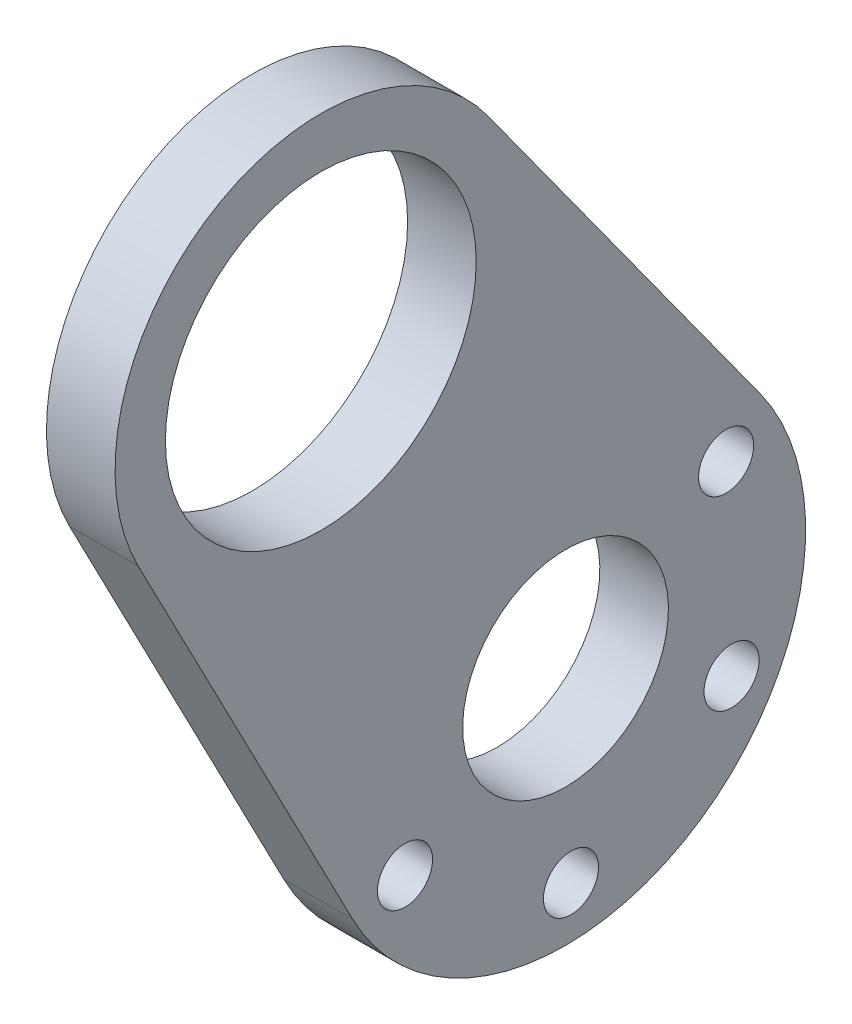
ISO-10303-21;
HEADER;
FILE_DESCRIPTION(('STEP AP214'),'2;1');
FILE_NAME('part.step','',(''),(''),'','','');
FILE_SCHEMA(('AUTOMOTIVE_DESIGN { 1 0 10303 214 1 1 1 1 }'));
ENDSEC;
DATA;
#1=APPLICATION_CONTEXT('core data for automotive mechanical design processes');
#2=APPLICATION_PROTOCOL_DEFINITION('international standard','automotive_design',2000,#1);
#3=PRODUCT_CONTEXT('',#1,'mechanical');
#4=PRODUCT('Part','Part','',(#3));
#5=PRODUCT_RELATED_PRODUCT_CATEGORY('part','',(#4));
#6=PRODUCT_DEFINITION_FORMATION('','',#4);
#7=PRODUCT_DEFINITION_CONTEXT('part definition',#1,'design');
#8=PRODUCT_DEFINITION('design','',#6,#7);
#9=PRODUCT_DEFINITION_SHAPE('','',#8);
#10=(LENGTH_UNIT() NAMED_UNIT(*) SI_UNIT(.MILLI.,.METRE.));
#11=(NAMED_UNIT(*) PLANE_ANGLE_UNIT() SI_UNIT($,.RADIAN.));
#12=(NAMED_UNIT(*) SI_UNIT($,.STERADIAN.) SOLID_ANGLE_UNIT());
#13=UNCERTAINTY_MEASURE_WITH_UNIT(LENGTH_MEASURE(1.E-05),#10,'distance_accuracy_value','');
#14=(GEOMETRIC_REPRESENTATION_CONTEXT(3) GLOBAL_UNCERTAINTY_ASSIGNED_CONTEXT((#13)) GLOBAL_UNIT_ASSIGNED_CONTEXT((#10,
#11,#12)) REPRESENTATION_CONTEXT('',''));
#15=CARTESIAN_POINT('',(0.,0.,0.));
#16=DIRECTION('',(0.,0.,1.));
#17=DIRECTION('',(1.,0.,0.));
#18=AXIS2_PLACEMENT_3D('',#15,#16,#17);
#19=CARTESIAN_POINT('',(288.925,295.519728238127,249.442641629893));
#20=DIRECTION('',(1.,0.,0.));
#21=DIRECTION('',(0.,1.,0.));
#22=AXIS2_PLACEMENT_3D('',#19,#20,#21);
#23=CYLINDRICAL_SURFACE('',#22,19.05);
#24=CARTESIAN_POINT('',(295.275,295.519728238127,249.442641629893));
#25=DIRECTION('',(-1.,0.,0.));
#26=DIRECTION('',(0.,-1.,0.));
#27=AXIS2_PLACEMENT_3D('',#24,#25,#26);
#28=CIRCLE('',#27,19.05);
#29=CARTESIAN_POINT('',(295.275,286.742668757373,266.350205820849));
#30=VERTEX_POINT('',#29);
#31=CARTESIAN_POINT('',(295.275,306.681555986926,234.005151506619));
#32=VERTEX_POINT('',#31);
#33=EDGE_CURVE('E104',#30,#32,#28,.T.);
#34=ORIENTED_EDGE('',*,*,#33,.T.);
#35=DIRECTION('',(1.,0.,0.));
#36=VECTOR('',#35,1.);
#37=CARTESIAN_POINT('',(288.925,306.681555986926,234.005151506619));
#38=LINE('',#37,#36);
#39=CARTESIAN_POINT('',(288.925,306.681555986926,234.005151506619));
#40=VERTEX_POINT('',#39);
#41=EDGE_CURVE('E11',#40,#32,#38,.T.);
#42=ORIENTED_EDGE('',*,*,#41,.F.);
#43=CARTESIAN_POINT('',(288.925,295.519728238127,249.442641629893));
#44=DIRECTION('',(-1.,0.,0.));
#45=DIRECTION('',(0.,-1.,0.));
#46=AXIS2_PLACEMENT_3D('',#43,#44,#45);
#47=CIRCLE('',#46,19.05);
#48=CARTESIAN_POINT('',(288.925,286.742668757373,266.350205820849));
#49=VERTEX_POINT('',#48);
#50=EDGE_CURVE('E92',#49,#40,#47,.T.);
#51=ORIENTED_EDGE('',*,*,#50,.F.);
#52=DIRECTION('',(1.,0.,0.));
#53=VECTOR('',#52,1.);
#54=CARTESIAN_POINT('',(288.925,286.742668757373,266.350205820849));
#55=LINE('',#54,#53);
#56=EDGE_CURVE('E49',#49,#30,#55,.T.);
#57=ORIENTED_EDGE('',*,*,#56,.T.);
#58=EDGE_LOOP('',(#34,#42,#51,#57));
#59=FACE_BOUND('',#58,.T.);
#60=ADVANCED_FACE('F46',(#59),#23,.T.);
#61=CARTESIAN_POINT('',(288.925,289.233094180261,221.3893231814));
#62=DIRECTION('',(0.,0.585922716472366,-0.81036693560488));
#63=DIRECTION('',(0.,0.81036693560488,0.585922716472366));
#64=AXIS2_PLACEMENT_3D('',#61,#62,#63);
#65=PLANE('',#64);
#66=DIRECTION('',(0.,0.81036693560488,0.585922716472366));
#67=VECTOR('',#66,1.);
#68=CARTESIAN_POINT('',(295.275,289.233094180261,221.3893231814));
#69=LINE('',#68,#67);
#70=CARTESIAN_POINT('',(295.275,271.784632373596,208.77349485618));
#71=VERTEX_POINT('',#70);
#72=EDGE_CURVE('E145',#71,#32,#69,.T.);
#73=ORIENTED_EDGE('',*,*,#72,.F.);
#74=DIRECTION('',(1.,0.,0.));
#75=VECTOR('',#74,1.);
#76=CARTESIAN_POINT('',(288.925,271.784632373596,208.77349485618));
#77=LINE('',#76,#75);
#78=CARTESIAN_POINT('',(288.925,271.784632373596,208.77349485618));
#79=VERTEX_POINT('',#78);
#80=EDGE_CURVE('E56',#79,#71,#77,.T.);
#81=ORIENTED_EDGE('',*,*,#80,.F.);
#82=DIRECTION('',(0.,0.81036693560488,0.585922716472366));
#83=VECTOR('',#82,1.);
#84=CARTESIAN_POINT('',(288.925,289.233094180261,221.3893231814));
#85=LINE('',#84,#83);
#86=EDGE_CURVE('E96',#79,#40,#85,.T.);
#87=ORIENTED_EDGE('',*,*,#86,.T.);
#88=ORIENTED_EDGE('',*,*,#41,.T.);
#89=EDGE_LOOP('',(#73,#81,#87,#88));
#90=FACE_BOUND('',#89,.T.);
#91=ADVANCED_FACE('F106',(#90),#65,.T.);
#92=CARTESIAN_POINT('',(288.925,258.7625,226.7839));
#93=DIRECTION('',(1.,0.,0.));
#94=DIRECTION('',(0.,1.,0.));
#95=AXIS2_PLACEMENT_3D('',#92,#93,#94);
#96=CYLINDRICAL_SURFACE('',#95,22.225);
#97=CARTESIAN_POINT('',(295.275,258.7625,226.7839));
#98=DIRECTION('',(-1.,0.,0.));
#99=DIRECTION('',(0.,-1.,0.));
#100=AXIS2_PLACEMENT_3D('',#97,#98,#99);
#101=CIRCLE('',#100,22.225);
#102=CARTESIAN_POINT('',(295.275,248.522597272452,246.509391556115));
#103=VERTEX_POINT('',#102);
#104=EDGE_CURVE('E100',#71,#103,#101,.T.);
#105=ORIENTED_EDGE('',*,*,#104,.T.);
#106=DIRECTION('',(1.,0.,0.));
#107=VECTOR('',#106,1.);
#108=CARTESIAN_POINT('',(288.925,248.522597272452,246.509391556115));
#109=LINE('',#108,#107);
#110=CARTESIAN_POINT('',(288.925,248.522597272452,246.509391556115));
#111=VERTEX_POINT('',#110);
#112=EDGE_CURVE('E80',#111,#103,#109,.T.);
#113=ORIENTED_EDGE('',*,*,#112,.F.);
#114=CARTESIAN_POINT('',(288.925,258.7625,226.7839));
#115=DIRECTION('',(-1.,0.,0.));
#116=DIRECTION('',(0.,-1.,0.));
#117=AXIS2_PLACEMENT_3D('',#114,#115,#116);
#118=CIRCLE('',#117,22.225);
#119=EDGE_CURVE('E134',#79,#111,#118,.T.);
#120=ORIENTED_EDGE('',*,*,#119,.F.);
#121=ORIENTED_EDGE('',*,*,#80,.T.);
#122=EDGE_LOOP('',(#105,#113,#120,#121));
#123=FACE_BOUND('',#122,.T.);
#124=ADVANCED_FACE('F217',(#123),#96,.T.);
#125=CARTESIAN_POINT('',(288.925,250.470715120155,211.415581622363));
#126=DIRECTION('',(1.,0.,0.));
#127=DIRECTION('',(0.,1.,0.));
#128=AXIS2_PLACEMENT_3D('',#125,#126,#127);
#129=CYLINDRICAL_SURFACE('',#128,2.5527);
#130=CARTESIAN_POINT('',(288.925,250.470715120155,211.415581622363));
#131=DIRECTION('',(-1.,0.,0.));
#132=DIRECTION('',(0.,-1.,0.));
#133=AXIS2_PLACEMENT_3D('',#130,#131,#132);
#134=CIRCLE('',#133,2.5527);
#135=CARTESIAN_POINT('',(288.925,247.918015120155,211.415581622363));
#136=VERTEX_POINT('',#135);
#137=EDGE_CURVE('E126',#136,#136,#134,.F.);
#138=ORIENTED_EDGE('',*,*,#137,.F.);
#139=EDGE_LOOP('',(#138));
#140=FACE_BOUND('',#139,.T.);
#141=CARTESIAN_POINT('',(295.275,250.470715120155,211.415581622363));
#142=DIRECTION('',(-1.,0.,0.));
#143=DIRECTION('',(0.,-1.,0.));
#144=AXIS2_PLACEMENT_3D('',#141,#142,#143);
#145=CIRCLE('',#144,2.5527);
#146=CARTESIAN_POINT('',(295.275,247.918015120155,211.415581622363));
#147=VERTEX_POINT('',#146);
#148=EDGE_CURVE('E160',#147,#147,#145,.F.);
#149=ORIENTED_EDGE('',*,*,#148,.T.);
#150=EDGE_LOOP('',(#149));
#151=FACE_BOUND('',#150,.T.);
#152=ADVANCED_FACE('F223',(#140,#151),#129,.F.);
#153=CARTESIAN_POINT('',(288.925,241.307253431596,226.28063715984));
#154=DIRECTION('',(1.,0.,0.));
#155=DIRECTION('',(0.,1.,0.));
#156=AXIS2_PLACEMENT_3D('',#153,#154,#155);
#157=CYLINDRICAL_SURFACE('',#156,2.5527);
#158=CARTESIAN_POINT('',(288.925,241.307253431596,226.28063715984));
#159=DIRECTION('',(-1.,0.,0.));
#160=DIRECTION('',(0.,-1.,0.));
#161=AXIS2_PLACEMENT_3D('',#158,#159,#160);
#162=CIRCLE('',#161,2.5527);
#163=CARTESIAN_POINT('',(288.925,238.754553431596,226.28063715984));
#164=VERTEX_POINT('',#163);
#165=EDGE_CURVE('E122',#164,#164,#162,.F.);
#166=ORIENTED_EDGE('',*,*,#165,.F.);
#167=EDGE_LOOP('',(#166));
#168=FACE_BOUND('',#167,.T.);
#169=CARTESIAN_POINT('',(295.275,241.307253431596,226.28063715984));
#170=DIRECTION('',(-1.,0.,0.));
#171=DIRECTION('',(0.,-1.,0.));
#172=AXIS2_PLACEMENT_3D('',#169,#170,#171);
#173=CIRCLE('',#172,2.5527);
#174=CARTESIAN_POINT('',(295.275,238.754553431596,226.28063715984));
#175=VERTEX_POINT('',#174);
#176=EDGE_CURVE('E156',#175,#175,#173,.F.);
#177=ORIENTED_EDGE('',*,*,#176,.T.);
#178=EDGE_LOOP('',(#177));
#179=FACE_BOUND('',#178,.T.);
#180=ADVANCED_FACE('F231',(#168,#179),#157,.F.);
#181=CARTESIAN_POINT('',(288.925,249.599038311439,241.648955537477));
#182=DIRECTION('',(1.,0.,0.));
#183=DIRECTION('',(0.,1.,0.));
#184=AXIS2_PLACEMENT_3D('',#181,#182,#183);
#185=CYLINDRICAL_SURFACE('',#184,2.5527);
#186=CARTESIAN_POINT('',(288.925,249.599038311439,241.648955537477));
#187=DIRECTION('',(-1.,0.,0.));
#188=DIRECTION('',(0.,-1.,0.));
#189=AXIS2_PLACEMENT_3D('',#186,#187,#188);
#190=CIRCLE('',#189,2.5527);
#191=CARTESIAN_POINT('',(288.925,247.046338311439,241.648955537477));
#192=VERTEX_POINT('',#191);
#193=EDGE_CURVE('E113',#192,#192,#190,.F.);
#194=ORIENTED_EDGE('',*,*,#193,.F.);
#195=EDGE_LOOP('',(#194));
#196=FACE_BOUND('',#195,.T.);
#197=CARTESIAN_POINT('',(295.275,249.599038311439,241.648955537477));
#198=DIRECTION('',(-1.,0.,0.));
#199=DIRECTION('',(0.,-1.,0.));
#200=AXIS2_PLACEMENT_3D('',#197,#198,#199);
#201=CIRCLE('',#200,2.5527);
#202=CARTESIAN_POINT('',(295.275,247.046338311439,241.648955537477));
#203=VERTEX_POINT('',#202);
#204=EDGE_CURVE('E152',#203,#203,#201,.F.);
#205=ORIENTED_EDGE('',*,*,#204,.T.);
#206=EDGE_LOOP('',(#205));
#207=FACE_BOUND('',#206,.T.);
#208=ADVANCED_FACE('F227',(#196,#207),#185,.F.);
#209=CARTESIAN_POINT('',(288.925,258.7625,226.7839));
#210=DIRECTION('',(1.,0.,0.));
#211=DIRECTION('',(0.,1.,0.));
#212=AXIS2_PLACEMENT_3D('',#209,#210,#211);
#213=CYLINDRICAL_SURFACE('',#212,9.525);
#214=CARTESIAN_POINT('',(288.925,258.7625,226.7839));
#215=DIRECTION('',(-1.,0.,0.));
#216=DIRECTION('',(0.,-1.,0.));
#217=AXIS2_PLACEMENT_3D('',#214,#215,#216);
#218=CIRCLE('',#217,9.525);
#219=CARTESIAN_POINT('',(288.925,249.2375,226.7839));
#220=VERTEX_POINT('',#219);
#221=EDGE_CURVE('E108',#220,#220,#218,.T.);
#222=ORIENTED_EDGE('',*,*,#221,.T.);
#223=EDGE_LOOP('',(#222));
#224=FACE_BOUND('',#223,.T.);
#225=CARTESIAN_POINT('',(295.275,258.7625,226.7839));
#226=DIRECTION('',(-1.,0.,0.));
#227=DIRECTION('',(0.,-1.,0.));
#228=AXIS2_PLACEMENT_3D('',#225,#226,#227);
#229=CIRCLE('',#228,9.525);
#230=CARTESIAN_POINT('',(295.275,249.2375,226.7839));
#231=VERTEX_POINT('',#230);
#232=EDGE_CURVE('E148',#231,#231,#229,.T.);
#233=ORIENTED_EDGE('',*,*,#232,.F.);
#234=EDGE_LOOP('',(#233));
#235=FACE_BOUND('',#234,.T.);
#236=ADVANCED_FACE('F209',(#224,#235),#213,.F.);
#237=CARTESIAN_POINT('',(288.925,267.632633014912,256.429798688482));
#238=DIRECTION('',(0.,-0.460738030485779,0.887536178002951));
#239=DIRECTION('',(0.,-0.887536178002951,-0.460738030485779));
#240=AXIS2_PLACEMENT_3D('',#237,#238,#239);
#241=PLANE('',#240);
#242=DIRECTION('',(0.,-0.887536178002951,-0.460738030485779));
#243=VECTOR('',#242,1.);
#244=CARTESIAN_POINT('',(295.275,267.632633014912,256.429798688482));
#245=LINE('',#244,#243);
#246=EDGE_CURVE('E137',#30,#103,#245,.T.);
#247=ORIENTED_EDGE('',*,*,#246,.F.);
#248=ORIENTED_EDGE('',*,*,#56,.F.);
#249=DIRECTION('',(0.,-0.887536178002951,-0.460738030485779));
#250=VECTOR('',#249,1.);
#251=CARTESIAN_POINT('',(288.925,267.632633014912,256.429798688482));
#252=LINE('',#251,#250);
#253=EDGE_CURVE('E97',#49,#111,#252,.T.);
#254=ORIENTED_EDGE('',*,*,#253,.T.);
#255=ORIENTED_EDGE('',*,*,#112,.T.);
#256=EDGE_LOOP('',(#247,#248,#254,#255));
#257=FACE_BOUND('',#256,.T.);
#258=ADVANCED_FACE('F197',(#257),#241,.T.);
#259=CARTESIAN_POINT('',(288.925,267.925961688557,211.918844462521));
#260=DIRECTION('',(1.,0.,0.));
#261=DIRECTION('',(0.,1.,0.));
#262=AXIS2_PLACEMENT_3D('',#259,#260,#261);
#263=CYLINDRICAL_SURFACE('',#262,2.5527);
#264=CARTESIAN_POINT('',(288.925,267.925961688557,211.918844462521));
#265=DIRECTION('',(-1.,0.,0.));
#266=DIRECTION('',(0.,-1.,0.));
#267=AXIS2_PLACEMENT_3D('',#264,#265,#266);
#268=CIRCLE('',#267,2.5527);
#269=CARTESIAN_POINT('',(288.925,265.373261688557,211.918844462521));
#270=VERTEX_POINT('',#269);
#271=EDGE_CURVE('E130',#270,#270,#268,.F.);
#272=ORIENTED_EDGE('',*,*,#271,.F.);
#273=EDGE_LOOP('',(#272));
#274=FACE_BOUND('',#273,.T.);
#275=CARTESIAN_POINT('',(295.275,267.925961688557,211.918844462521));
#276=DIRECTION('',(-1.,0.,0.));
#277=DIRECTION('',(0.,-1.,0.));
#278=AXIS2_PLACEMENT_3D('',#275,#276,#277);
#279=CIRCLE('',#278,2.5527);
#280=CARTESIAN_POINT('',(295.275,265.373261688557,211.918844462521));
#281=VERTEX_POINT('',#280);
#282=EDGE_CURVE('E141',#281,#281,#279,.F.);
#283=ORIENTED_EDGE('',*,*,#282,.T.);
#284=EDGE_LOOP('',(#283));
#285=FACE_BOUND('',#284,.T.);
#286=ADVANCED_FACE('F195',(#274,#285),#263,.F.);
#287=CARTESIAN_POINT('',(288.925,275.553614119063,236.525770814946));
#288=DIRECTION('',(-1.,0.,0.));
#289=DIRECTION('',(0.,-1.,0.));
#290=AXIS2_PLACEMENT_3D('',#287,#288,#289);
#291=PLANE('',#290);
#292=CARTESIAN_POINT('',(288.925,295.519728238127,249.442641629892));
#293=DIRECTION('',(-1.,0.,0.));
#294=DIRECTION('',(0.,-1.,0.));
#295=AXIS2_PLACEMENT_3D('',#292,#293,#294);
#296=CIRCLE('',#295,14.3875);
#297=CARTESIAN_POINT('',(288.925,281.132228238127,249.442641629892));
#298=VERTEX_POINT('',#297);
#299=EDGE_CURVE('E138',#298,#298,#296,.T.);
#300=ORIENTED_EDGE('',*,*,#299,.F.);
#301=EDGE_LOOP('',(#300));
#302=FACE_BOUND('',#301,.T.);
#303=ORIENTED_EDGE('',*,*,#50,.T.);
#304=ORIENTED_EDGE('',*,*,#86,.F.);
#305=ORIENTED_EDGE('',*,*,#119,.T.);
#306=ORIENTED_EDGE('',*,*,#253,.F.);
#307=EDGE_LOOP('',(#303,#304,#305,#306));
#308=FACE_BOUND('',#307,.T.);
#309=ORIENTED_EDGE('',*,*,#221,.F.);
#310=EDGE_LOOP('',(#309));
#311=FACE_BOUND('',#310,.T.);
#312=ORIENTED_EDGE('',*,*,#193,.T.);
#313=EDGE_LOOP('',(#312));
#314=FACE_BOUND('',#313,.T.);
#315=ORIENTED_EDGE('',*,*,#165,.T.);
#316=EDGE_LOOP('',(#315));
#317=FACE_BOUND('',#316,.T.);
#318=ORIENTED_EDGE('',*,*,#137,.T.);
#319=EDGE_LOOP('',(#318));
#320=FACE_BOUND('',#319,.T.);
#321=ORIENTED_EDGE('',*,*,#271,.T.);
#322=EDGE_LOOP('',(#321));
#323=FACE_BOUND('',#322,.T.);
#324=ADVANCED_FACE('F94',(#302,#308,#311,#314,#317,#320,#323),#291,.T.);
#325=CARTESIAN_POINT('',(295.275,275.553614119063,236.525770814946));
#326=DIRECTION('',(-1.,0.,0.));
#327=DIRECTION('',(0.,-1.,0.));
#328=AXIS2_PLACEMENT_3D('',#325,#326,#327);
#329=PLANE('',#328);
#330=CARTESIAN_POINT('',(295.275,295.519728238127,249.442641629892));
#331=DIRECTION('',(1.,0.,0.));
#332=DIRECTION('',(0.,1.,0.));
#333=AXIS2_PLACEMENT_3D('',#330,#331,#332);
#334=CIRCLE('',#333,14.3875);
#335=CARTESIAN_POINT('',(295.275,309.907228238127,249.442641629892));
#336=VERTEX_POINT('',#335);
#337=EDGE_CURVE('E174',#336,#336,#334,.T.);
#338=ORIENTED_EDGE('',*,*,#337,.F.);
#339=EDGE_LOOP('',(#338));
#340=FACE_BOUND('',#339,.T.);
#341=ORIENTED_EDGE('',*,*,#33,.F.);
#342=ORIENTED_EDGE('',*,*,#246,.T.);
#343=ORIENTED_EDGE('',*,*,#104,.F.);
#344=ORIENTED_EDGE('',*,*,#72,.T.);
#345=EDGE_LOOP('',(#341,#342,#343,#344));
#346=FACE_BOUND('',#345,.T.);
#347=ORIENTED_EDGE('',*,*,#232,.T.);
#348=EDGE_LOOP('',(#347));
#349=FACE_BOUND('',#348,.T.);
#350=ORIENTED_EDGE('',*,*,#204,.F.);
#351=EDGE_LOOP('',(#350));
#352=FACE_BOUND('',#351,.T.);
#353=ORIENTED_EDGE('',*,*,#176,.F.);
#354=EDGE_LOOP('',(#353));
#355=FACE_BOUND('',#354,.T.);
#356=ORIENTED_EDGE('',*,*,#148,.F.);
#357=EDGE_LOOP('',(#356));
#358=FACE_BOUND('',#357,.T.);
#359=ORIENTED_EDGE('',*,*,#282,.F.);
#360=EDGE_LOOP('',(#359));
#361=FACE_BOUND('',#360,.T.);
#362=ADVANCED_FACE('F180',(#340,#346,#349,#352,#355,#358,#361),#329,.F.);
#363=CARTESIAN_POINT('',(285.275,295.519728238127,249.442641629892));
#364=DIRECTION('',(1.,0.,0.));
#365=DIRECTION('',(0.,1.,0.));
#366=AXIS2_PLACEMENT_3D('',#363,#364,#365);
#367=CYLINDRICAL_SURFACE('',#366,14.3875);
#368=ORIENTED_EDGE('',*,*,#299,.T.);
#369=EDGE_LOOP('',(#368));
#370=FACE_BOUND('',#369,.T.);
#371=ORIENTED_EDGE('',*,*,#337,.T.);
#372=EDGE_LOOP('',(#371));
#373=FACE_BOUND('',#372,.T.);
#374=ADVANCED_FACE('F178',(#370,#373),#367,.F.);
#375=CLOSED_SHELL('',(#60,#91,#124,#152,#180,#208,#236,#258,#286,#324,#362,#374));
#376=MANIFOLD_SOLID_BREP('B2',#375);
#377=ADVANCED_BREP_SHAPE_REPRESENTATION('',(#18,#376),#14);
#378=SHAPE_DEFINITION_REPRESENTATION(#9,#377);
ENDSEC;
END-ISO-10303-21;
